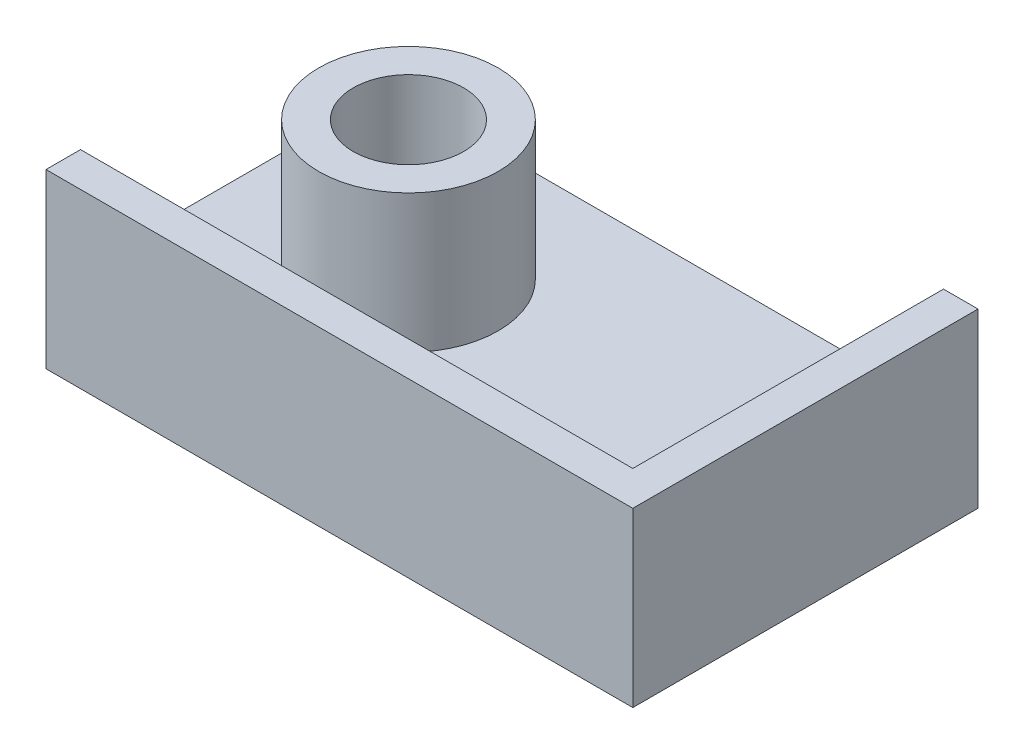
ISO-10303-21;
HEADER;
FILE_DESCRIPTION(('STEP AP214'),'2;1');
FILE_NAME('part.step','',(''),(''),'','','');
FILE_SCHEMA(('AUTOMOTIVE_DESIGN { 1 0 10303 214 1 1 1 1 }'));
ENDSEC;
DATA;
#1=APPLICATION_CONTEXT('core data for automotive mechanical design processes');
#2=APPLICATION_PROTOCOL_DEFINITION('international standard','automotive_design',2000,#1);
#3=PRODUCT_CONTEXT('',#1,'mechanical');
#4=PRODUCT('Part','Part','',(#3));
#5=PRODUCT_RELATED_PRODUCT_CATEGORY('part','',(#4));
#6=PRODUCT_DEFINITION_FORMATION('','',#4);
#7=PRODUCT_DEFINITION_CONTEXT('part definition',#1,'design');
#8=PRODUCT_DEFINITION('design','',#6,#7);
#9=PRODUCT_DEFINITION_SHAPE('','',#8);
#10=(LENGTH_UNIT() NAMED_UNIT(*) SI_UNIT(.MILLI.,.METRE.));
#11=(NAMED_UNIT(*) PLANE_ANGLE_UNIT() SI_UNIT($,.RADIAN.));
#12=(NAMED_UNIT(*) SI_UNIT($,.STERADIAN.) SOLID_ANGLE_UNIT());
#13=UNCERTAINTY_MEASURE_WITH_UNIT(LENGTH_MEASURE(1.E-05),#10,'distance_accuracy_value','');
#14=(GEOMETRIC_REPRESENTATION_CONTEXT(3) GLOBAL_UNCERTAINTY_ASSIGNED_CONTEXT((#13)) GLOBAL_UNIT_ASSIGNED_CONTEXT((#10,
#11,#12)) REPRESENTATION_CONTEXT('',''));
#15=CARTESIAN_POINT('',(0.,0.,0.));
#16=DIRECTION('',(0.,0.,1.));
#17=DIRECTION('',(1.,0.,0.));
#18=AXIS2_PLACEMENT_3D('',#15,#16,#17);
#19=CARTESIAN_POINT('',(-8.,2.,-4.5));
#20=DIRECTION('',(0.,0.,1.));
#21=DIRECTION('',(1.,0.,0.));
#22=AXIS2_PLACEMENT_3D('',#19,#20,#21);
#23=PLANE('',#22);
#24=DIRECTION('',(-1.,0.,0.));
#25=VECTOR('',#24,1.);
#26=CARTESIAN_POINT('',(-8.,0.,-4.5));
#27=LINE('',#26,#25);
#28=CARTESIAN_POINT('',(9.,0.,-4.5));
#29=VERTEX_POINT('',#28);
#30=CARTESIAN_POINT('',(-8.,0.,-4.5));
#31=VERTEX_POINT('',#30);
#32=EDGE_CURVE('E166',#29,#31,#27,.T.);
#33=ORIENTED_EDGE('',*,*,#32,.T.);
#34=DIRECTION('',(0.,-1.,0.));
#35=VECTOR('',#34,1.);
#36=CARTESIAN_POINT('',(-8.,2.,-4.5));
#37=LINE('',#36,#35);
#38=CARTESIAN_POINT('',(-8.,2.,-4.5));
#39=VERTEX_POINT('',#38);
#40=EDGE_CURVE('E48',#39,#31,#37,.T.);
#41=ORIENTED_EDGE('',*,*,#40,.F.);
#42=DIRECTION('',(-1.,0.,0.));
#43=VECTOR('',#42,1.);
#44=CARTESIAN_POINT('',(-8.,2.,-4.5));
#45=LINE('',#44,#43);
#46=CARTESIAN_POINT('',(8.,2.,-4.5));
#47=VERTEX_POINT('',#46);
#48=EDGE_CURVE('E170',#47,#39,#45,.T.);
#49=ORIENTED_EDGE('',*,*,#48,.F.);
#50=DIRECTION('',(0.,1.,0.));
#51=VECTOR('',#50,1.);
#52=CARTESIAN_POINT('',(8.,-19.723082923316,-4.5));
#53=LINE('',#52,#51);
#54=CARTESIAN_POINT('',(8.,5.,-4.5));
#55=VERTEX_POINT('',#54);
#56=EDGE_CURVE('E154',#47,#55,#53,.T.);
#57=ORIENTED_EDGE('',*,*,#56,.T.);
#58=DIRECTION('',(-1.,0.,0.));
#59=VECTOR('',#58,1.);
#60=CARTESIAN_POINT('',(9.,5.,-4.5));
#61=LINE('',#60,#59);
#62=CARTESIAN_POINT('',(9.,5.,-4.5));
#63=VERTEX_POINT('',#62);
#64=EDGE_CURVE('E137',#63,#55,#61,.T.);
#65=ORIENTED_EDGE('',*,*,#64,.F.);
#66=DIRECTION('',(0.,1.,0.));
#67=VECTOR('',#66,1.);
#68=CARTESIAN_POINT('',(9.,-19.723082923316,-4.5));
#69=LINE('',#68,#67);
#70=EDGE_CURVE('E146',#29,#63,#69,.T.);
#71=ORIENTED_EDGE('',*,*,#70,.F.);
#72=EDGE_LOOP('',(#33,#41,#49,#57,#65,#71));
#73=FACE_BOUND('',#72,.T.);
#74=ADVANCED_FACE('F39',(#73),#23,.F.);
#75=CARTESIAN_POINT('',(-8.,2.,4.5));
#76=DIRECTION('',(1.,0.,0.));
#77=DIRECTION('',(0.,0.,-1.));
#78=AXIS2_PLACEMENT_3D('',#75,#76,#77);
#79=PLANE('',#78);
#80=DIRECTION('',(0.,0.,1.));
#81=VECTOR('',#80,1.);
#82=CARTESIAN_POINT('',(-8.,0.,4.5));
#83=LINE('',#82,#81);
#84=CARTESIAN_POINT('',(-8.,0.,5.5));
#85=VERTEX_POINT('',#84);
#86=EDGE_CURVE('E171',#31,#85,#83,.T.);
#87=ORIENTED_EDGE('',*,*,#86,.T.);
#88=DIRECTION('',(0.,1.,0.));
#89=VECTOR('',#88,1.);
#90=CARTESIAN_POINT('',(-8.,-19.723082923316,5.5));
#91=LINE('',#90,#89);
#92=CARTESIAN_POINT('',(-8.,5.,5.5));
#93=VERTEX_POINT('',#92);
#94=EDGE_CURVE('E110',#85,#93,#91,.T.);
#95=ORIENTED_EDGE('',*,*,#94,.T.);
#96=DIRECTION('',(0.,0.,1.));
#97=VECTOR('',#96,1.);
#98=CARTESIAN_POINT('',(-8.,5.,4.5));
#99=LINE('',#98,#97);
#100=CARTESIAN_POINT('',(-8.,5.,4.5));
#101=VERTEX_POINT('',#100);
#102=EDGE_CURVE('E107',#101,#93,#99,.T.);
#103=ORIENTED_EDGE('',*,*,#102,.F.);
#104=DIRECTION('',(0.,1.,0.));
#105=VECTOR('',#104,1.);
#106=CARTESIAN_POINT('',(-8.,-19.723082923316,4.5));
#107=LINE('',#106,#105);
#108=CARTESIAN_POINT('',(-8.,2.,4.5));
#109=VERTEX_POINT('',#108);
#110=EDGE_CURVE('E94',#109,#101,#107,.T.);
#111=ORIENTED_EDGE('',*,*,#110,.F.);
#112=DIRECTION('',(0.,0.,1.));
#113=VECTOR('',#112,1.);
#114=CARTESIAN_POINT('',(-8.,2.,4.5));
#115=LINE('',#114,#113);
#116=EDGE_CURVE('E174',#39,#109,#115,.T.);
#117=ORIENTED_EDGE('',*,*,#116,.F.);
#118=ORIENTED_EDGE('',*,*,#40,.T.);
#119=EDGE_LOOP('',(#87,#95,#103,#111,#117,#118));
#120=FACE_BOUND('',#119,.T.);
#121=ADVANCED_FACE('F108',(#120),#79,.F.);
#122=CARTESIAN_POINT('',(0.,2.,0.));
#123=DIRECTION('',(0.,-1.,0.));
#124=DIRECTION('',(0.,0.,-1.));
#125=AXIS2_PLACEMENT_3D('',#122,#123,#124);
#126=PLANE('',#125);
#127=CARTESIAN_POINT('',(-3.00000000000001,2.,0.));
#128=DIRECTION('',(0.,-1.,0.));
#129=DIRECTION('',(0.,0.,-1.));
#130=AXIS2_PLACEMENT_3D('',#127,#128,#129);
#131=CIRCLE('',#130,2.6);
#132=CARTESIAN_POINT('',(-3.00000000000001,2.,-2.6));
#133=VERTEX_POINT('',#132);
#134=EDGE_CURVE('E11',#133,#133,#131,.F.);
#135=ORIENTED_EDGE('',*,*,#134,.F.);
#136=EDGE_LOOP('',(#135));
#137=FACE_BOUND('',#136,.T.);
#138=DIRECTION('',(0.,0.,-1.));
#139=VECTOR('',#138,1.);
#140=CARTESIAN_POINT('',(8.,2.,4.5));
#141=LINE('',#140,#139);
#142=CARTESIAN_POINT('',(8.,2.,4.5));
#143=VERTEX_POINT('',#142);
#144=EDGE_CURVE('E167',#143,#47,#141,.T.);
#145=ORIENTED_EDGE('',*,*,#144,.T.);
#146=ORIENTED_EDGE('',*,*,#48,.T.);
#147=ORIENTED_EDGE('',*,*,#116,.T.);
#148=DIRECTION('',(1.,0.,0.));
#149=VECTOR('',#148,1.);
#150=CARTESIAN_POINT('',(-8.,2.,4.5));
#151=LINE('',#150,#149);
#152=EDGE_CURVE('E55',#109,#143,#151,.T.);
#153=ORIENTED_EDGE('',*,*,#152,.T.);
#154=EDGE_LOOP('',(#145,#146,#147,#153));
#155=FACE_BOUND('',#154,.T.);
#156=ADVANCED_FACE('F202',(#137,#155),#126,.F.);
#157=CARTESIAN_POINT('',(0.,0.,0.));
#158=DIRECTION('',(0.,-1.,0.));
#159=DIRECTION('',(0.,0.,-1.));
#160=AXIS2_PLACEMENT_3D('',#157,#158,#159);
#161=PLANE('',#160);
#162=CARTESIAN_POINT('',(-3.00000000000001,0.,0.));
#163=DIRECTION('',(0.,1.,0.));
#164=DIRECTION('',(0.,0.,1.));
#165=AXIS2_PLACEMENT_3D('',#162,#163,#164);
#166=CIRCLE('',#165,1.6);
#167=CARTESIAN_POINT('',(-3.00000000000001,0.,1.6));
#168=VERTEX_POINT('',#167);
#169=EDGE_CURVE('E123',#168,#168,#166,.T.);
#170=ORIENTED_EDGE('',*,*,#169,.T.);
#171=EDGE_LOOP('',(#170));
#172=FACE_BOUND('',#171,.T.);
#173=ORIENTED_EDGE('',*,*,#32,.F.);
#174=DIRECTION('',(0.,0.,-1.));
#175=VECTOR('',#174,1.);
#176=CARTESIAN_POINT('',(9.,0.,5.5));
#177=LINE('',#176,#175);
#178=CARTESIAN_POINT('',(9.,0.,5.5));
#179=VERTEX_POINT('',#178);
#180=EDGE_CURVE('E142',#179,#29,#177,.T.);
#181=ORIENTED_EDGE('',*,*,#180,.F.);
#182=DIRECTION('',(1.,0.,0.));
#183=VECTOR('',#182,1.);
#184=CARTESIAN_POINT('',(-8.,0.,5.5));
#185=LINE('',#184,#183);
#186=EDGE_CURVE('E148',#85,#179,#185,.T.);
#187=ORIENTED_EDGE('',*,*,#186,.F.);
#188=ORIENTED_EDGE('',*,*,#86,.F.);
#189=EDGE_LOOP('',(#173,#181,#187,#188));
#190=FACE_BOUND('',#189,.T.);
#191=ADVANCED_FACE('F190',(#172,#190),#161,.T.);
#192=CARTESIAN_POINT('',(-3.00000000000001,6.,0.));
#193=DIRECTION('',(0.,-1.,0.));
#194=DIRECTION('',(0.,0.,-1.));
#195=AXIS2_PLACEMENT_3D('',#192,#193,#194);
#196=CYLINDRICAL_SURFACE('',#195,2.6);
#197=CARTESIAN_POINT('',(-3.00000000000001,6.,0.));
#198=DIRECTION('',(0.,1.,0.));
#199=DIRECTION('',(0.,0.,1.));
#200=AXIS2_PLACEMENT_3D('',#197,#198,#199);
#201=CIRCLE('',#200,2.6);
#202=CARTESIAN_POINT('',(-3.00000000000001,6.,2.6));
#203=VERTEX_POINT('',#202);
#204=EDGE_CURVE('E103',#203,#203,#201,.T.);
#205=ORIENTED_EDGE('',*,*,#204,.F.);
#206=EDGE_LOOP('',(#205));
#207=FACE_BOUND('',#206,.T.);
#208=ORIENTED_EDGE('',*,*,#134,.T.);
#209=EDGE_LOOP('',(#208));
#210=FACE_BOUND('',#209,.T.);
#211=ADVANCED_FACE('F210',(#207,#210),#196,.T.);
#212=CARTESIAN_POINT('',(-3.00000000000001,6.,0.));
#213=DIRECTION('',(0.,1.,0.));
#214=DIRECTION('',(0.,0.,1.));
#215=AXIS2_PLACEMENT_3D('',#212,#213,#214);
#216=PLANE('',#215);
#217=CARTESIAN_POINT('',(-3.00000000000001,6.,0.));
#218=DIRECTION('',(0.,1.,0.));
#219=DIRECTION('',(0.,0.,1.));
#220=AXIS2_PLACEMENT_3D('',#217,#218,#219);
#221=CIRCLE('',#220,1.6);
#222=CARTESIAN_POINT('',(-3.00000000000001,6.,1.6));
#223=VERTEX_POINT('',#222);
#224=EDGE_CURVE('E127',#223,#223,#221,.T.);
#225=ORIENTED_EDGE('',*,*,#224,.F.);
#226=EDGE_LOOP('',(#225));
#227=FACE_BOUND('',#226,.T.);
#228=ORIENTED_EDGE('',*,*,#204,.T.);
#229=EDGE_LOOP('',(#228));
#230=FACE_BOUND('',#229,.T.);
#231=ADVANCED_FACE('F239',(#227,#230),#216,.T.);
#232=CARTESIAN_POINT('',(8.,-19.723082923316,-4.5));
#233=DIRECTION('',(-1.,0.,0.));
#234=DIRECTION('',(0.,0.,1.));
#235=AXIS2_PLACEMENT_3D('',#232,#233,#234);
#236=PLANE('',#235);
#237=ORIENTED_EDGE('',*,*,#144,.F.);
#238=DIRECTION('',(0.,1.,0.));
#239=VECTOR('',#238,1.);
#240=CARTESIAN_POINT('',(8.,-19.723082923316,4.5));
#241=LINE('',#240,#239);
#242=CARTESIAN_POINT('',(8.,5.,4.5));
#243=VERTEX_POINT('',#242);
#244=EDGE_CURVE('E104',#143,#243,#241,.T.);
#245=ORIENTED_EDGE('',*,*,#244,.T.);
#246=DIRECTION('',(0.,0.,1.));
#247=VECTOR('',#246,1.);
#248=CARTESIAN_POINT('',(8.,5.,-4.5));
#249=LINE('',#248,#247);
#250=EDGE_CURVE('E121',#55,#243,#249,.T.);
#251=ORIENTED_EDGE('',*,*,#250,.F.);
#252=ORIENTED_EDGE('',*,*,#56,.F.);
#253=EDGE_LOOP('',(#237,#245,#251,#252));
#254=FACE_BOUND('',#253,.T.);
#255=ADVANCED_FACE('F201',(#254),#236,.T.);
#256=CARTESIAN_POINT('',(8.,-19.723082923316,4.5));
#257=DIRECTION('',(0.,0.,-1.));
#258=DIRECTION('',(-1.,0.,0.));
#259=AXIS2_PLACEMENT_3D('',#256,#257,#258);
#260=PLANE('',#259);
#261=ORIENTED_EDGE('',*,*,#152,.F.);
#262=ORIENTED_EDGE('',*,*,#110,.T.);
#263=DIRECTION('',(-1.,0.,0.));
#264=VECTOR('',#263,1.);
#265=CARTESIAN_POINT('',(8.,5.,4.5));
#266=LINE('',#265,#264);
#267=EDGE_CURVE('E99',#243,#101,#266,.T.);
#268=ORIENTED_EDGE('',*,*,#267,.F.);
#269=ORIENTED_EDGE('',*,*,#244,.F.);
#270=EDGE_LOOP('',(#261,#262,#268,#269));
#271=FACE_BOUND('',#270,.T.);
#272=ADVANCED_FACE('F96',(#271),#260,.T.);
#273=CARTESIAN_POINT('',(-8.,-19.723082923316,5.5));
#274=DIRECTION('',(0.,0.,1.));
#275=DIRECTION('',(1.,0.,0.));
#276=AXIS2_PLACEMENT_3D('',#273,#274,#275);
#277=PLANE('',#276);
#278=ORIENTED_EDGE('',*,*,#94,.F.);
#279=ORIENTED_EDGE('',*,*,#186,.T.);
#280=DIRECTION('',(0.,1.,0.));
#281=VECTOR('',#280,1.);
#282=CARTESIAN_POINT('',(9.,-19.723082923316,5.5));
#283=LINE('',#282,#281);
#284=CARTESIAN_POINT('',(9.,5.,5.5));
#285=VERTEX_POINT('',#284);
#286=EDGE_CURVE('E147',#179,#285,#283,.T.);
#287=ORIENTED_EDGE('',*,*,#286,.T.);
#288=DIRECTION('',(1.,0.,0.));
#289=VECTOR('',#288,1.);
#290=CARTESIAN_POINT('',(-8.,5.,5.5));
#291=LINE('',#290,#289);
#292=EDGE_CURVE('E115',#93,#285,#291,.T.);
#293=ORIENTED_EDGE('',*,*,#292,.F.);
#294=EDGE_LOOP('',(#278,#279,#287,#293));
#295=FACE_BOUND('',#294,.T.);
#296=ADVANCED_FACE('F194',(#295),#277,.T.);
#297=CARTESIAN_POINT('',(9.,-19.723082923316,5.5));
#298=DIRECTION('',(1.,0.,0.));
#299=DIRECTION('',(0.,0.,-1.));
#300=AXIS2_PLACEMENT_3D('',#297,#298,#299);
#301=PLANE('',#300);
#302=ORIENTED_EDGE('',*,*,#286,.F.);
#303=ORIENTED_EDGE('',*,*,#180,.T.);
#304=ORIENTED_EDGE('',*,*,#70,.T.);
#305=DIRECTION('',(0.,0.,-1.));
#306=VECTOR('',#305,1.);
#307=CARTESIAN_POINT('',(9.,5.,5.5));
#308=LINE('',#307,#306);
#309=EDGE_CURVE('E133',#285,#63,#308,.T.);
#310=ORIENTED_EDGE('',*,*,#309,.F.);
#311=EDGE_LOOP('',(#302,#303,#304,#310));
#312=FACE_BOUND('',#311,.T.);
#313=ADVANCED_FACE('F198',(#312),#301,.T.);
#314=CARTESIAN_POINT('',(0.,5.,0.));
#315=DIRECTION('',(0.,1.,0.));
#316=DIRECTION('',(0.,0.,1.));
#317=AXIS2_PLACEMENT_3D('',#314,#315,#316);
#318=PLANE('',#317);
#319=ORIENTED_EDGE('',*,*,#267,.T.);
#320=ORIENTED_EDGE('',*,*,#102,.T.);
#321=ORIENTED_EDGE('',*,*,#292,.T.);
#322=ORIENTED_EDGE('',*,*,#309,.T.);
#323=ORIENTED_EDGE('',*,*,#64,.T.);
#324=ORIENTED_EDGE('',*,*,#250,.T.);
#325=EDGE_LOOP('',(#319,#320,#321,#322,#323,#324));
#326=FACE_BOUND('',#325,.T.);
#327=ADVANCED_FACE('F118',(#326),#318,.T.);
#328=CARTESIAN_POINT('',(-3.00000000000001,0.,0.));
#329=DIRECTION('',(0.,1.,0.));
#330=DIRECTION('',(0.,0.,1.));
#331=AXIS2_PLACEMENT_3D('',#328,#329,#330);
#332=CYLINDRICAL_SURFACE('',#331,1.6);
#333=ORIENTED_EDGE('',*,*,#169,.F.);
#334=EDGE_LOOP('',(#333));
#335=FACE_BOUND('',#334,.T.);
#336=ORIENTED_EDGE('',*,*,#224,.T.);
#337=EDGE_LOOP('',(#336));
#338=FACE_BOUND('',#337,.T.);
#339=ADVANCED_FACE('F273',(#335,#338),#332,.F.);
#340=CLOSED_SHELL('',(#74,#121,#156,#191,#211,#231,#255,#272,#296,#313,#327,#339));
#341=MANIFOLD_SOLID_BREP('B2',#340);
#342=ADVANCED_BREP_SHAPE_REPRESENTATION('',(#18,#341),#14);
#343=SHAPE_DEFINITION_REPRESENTATION(#9,#342);
ENDSEC;
END-ISO-10303-21;
